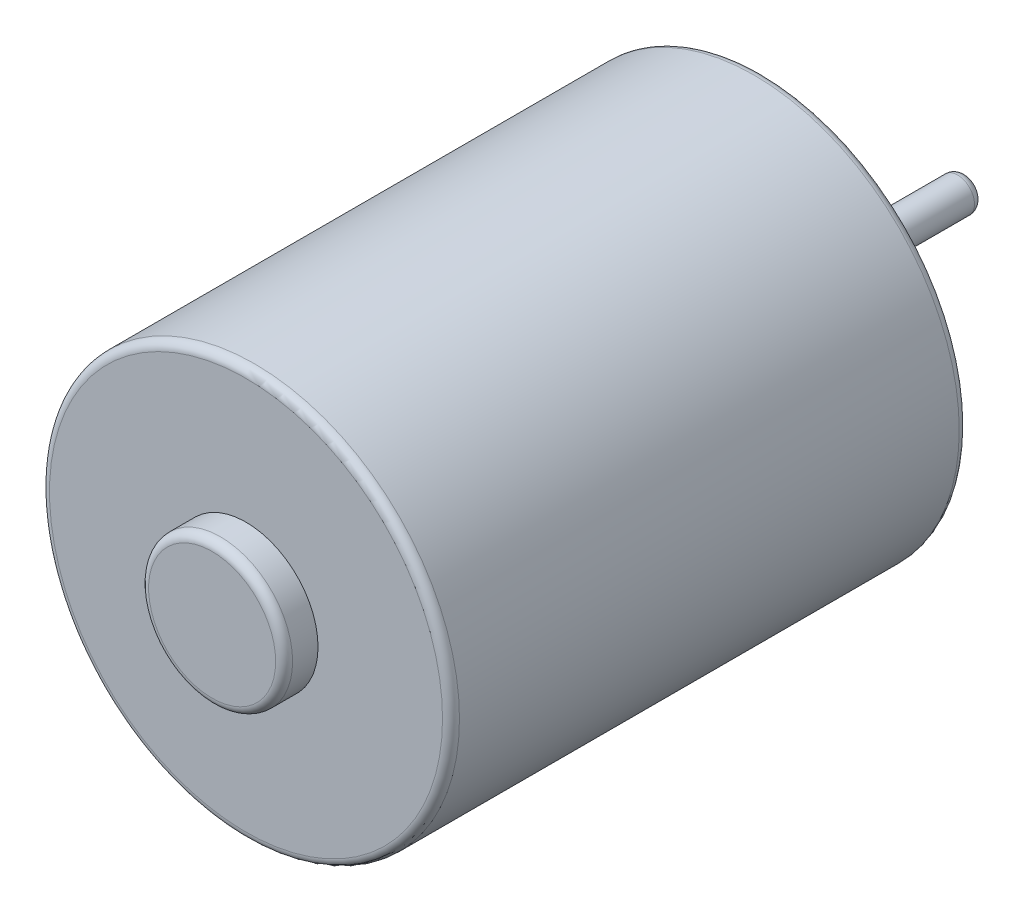
ISO-10303-21;
HEADER;
FILE_DESCRIPTION(('STEP AP214'),'2;1');
FILE_NAME('part.step','',(''),(''),'','','');
FILE_SCHEMA(('AUTOMOTIVE_DESIGN { 1 0 10303 214 1 1 1 1 }'));
ENDSEC;
DATA;
#1=APPLICATION_CONTEXT('core data for automotive mechanical design processes');
#2=APPLICATION_PROTOCOL_DEFINITION('international standard','automotive_design',2000,#1);
#3=PRODUCT_CONTEXT('',#1,'mechanical');
#4=PRODUCT('Part','Part','',(#3));
#5=PRODUCT_RELATED_PRODUCT_CATEGORY('part','',(#4));
#6=PRODUCT_DEFINITION_FORMATION('','',#4);
#7=PRODUCT_DEFINITION_CONTEXT('part definition',#1,'design');
#8=PRODUCT_DEFINITION('design','',#6,#7);
#9=PRODUCT_DEFINITION_SHAPE('','',#8);
#10=(LENGTH_UNIT() NAMED_UNIT(*) SI_UNIT(.MILLI.,.METRE.));
#11=(NAMED_UNIT(*) PLANE_ANGLE_UNIT() SI_UNIT($,.RADIAN.));
#12=(NAMED_UNIT(*) SI_UNIT($,.STERADIAN.) SOLID_ANGLE_UNIT());
#13=UNCERTAINTY_MEASURE_WITH_UNIT(LENGTH_MEASURE(1.E-05),#10,'distance_accuracy_value','');
#14=(GEOMETRIC_REPRESENTATION_CONTEXT(3) GLOBAL_UNCERTAINTY_ASSIGNED_CONTEXT((#13)) GLOBAL_UNIT_ASSIGNED_CONTEXT((#10,
#11,#12)) REPRESENTATION_CONTEXT('',''));
#15=CARTESIAN_POINT('',(0.,0.,0.));
#16=DIRECTION('',(0.,0.,1.));
#17=DIRECTION('',(1.,0.,0.));
#18=AXIS2_PLACEMENT_3D('',#15,#16,#17);
#19=CARTESIAN_POINT('',(0.,0.,30.5));
#20=DIRECTION('',(0.,0.,-1.));
#21=DIRECTION('',(-1.,0.,0.));
#22=AXIS2_PLACEMENT_3D('',#19,#20,#21);
#23=CYLINDRICAL_SURFACE('',#22,12.1);
#24=CARTESIAN_POINT('',(0.,0.,0.5));
#25=DIRECTION('',(0.,0.,1.));
#26=DIRECTION('',(1.,0.,0.));
#27=AXIS2_PLACEMENT_3D('',#24,#25,#26);
#28=CIRCLE('',#27,12.1);
#29=CARTESIAN_POINT('',(-12.1,0.,0.499999999999997));
#30=VERTEX_POINT('',#29);
#31=EDGE_CURVE('E55',#30,#30,#28,.T.);
#32=CARTESIAN_POINT('',(0.,0.,30.));
#33=DIRECTION('',(0.,0.,1.));
#34=DIRECTION('',(1.,0.,0.));
#35=AXIS2_PLACEMENT_3D('',#32,#33,#34);
#36=CIRCLE('',#35,12.1);
#37=CARTESIAN_POINT('',(-12.1,0.,30.));
#38=VERTEX_POINT('',#37);
#39=EDGE_CURVE('E58',#38,#38,#36,.F.);
#40=CARTESIAN_POINT('',(-12.1,0.,0.499999999999997));
#41=CARTESIAN_POINT('',(-12.1,0.,0.807291666666663));
#42=CARTESIAN_POINT('',(-12.1,0.,1.11458333333333));
#43=CARTESIAN_POINT('',(-12.1,0.,1.72916666666666));
#44=CARTESIAN_POINT('',(-12.1,0.,2.03645833333333));
#45=CARTESIAN_POINT('',(-12.1,0.,2.65104166666666));
#46=CARTESIAN_POINT('',(-12.1,0.,2.95833333333333));
#47=CARTESIAN_POINT('',(-12.1,0.,3.57291666666666));
#48=CARTESIAN_POINT('',(-12.1,0.,3.88020833333333));
#49=CARTESIAN_POINT('',(-12.1,0.,4.49479166666666));
#50=CARTESIAN_POINT('',(-12.1,0.,4.80208333333333));
#51=CARTESIAN_POINT('',(-12.1,0.,5.41666666666666));
#52=CARTESIAN_POINT('',(-12.1,0.,5.72395833333333));
#53=CARTESIAN_POINT('',(-12.1,0.,6.33854166666667));
#54=CARTESIAN_POINT('',(-12.1,0.,6.64583333333333));
#55=CARTESIAN_POINT('',(-12.1,0.,7.26041666666666));
#56=CARTESIAN_POINT('',(-12.1,0.,7.56770833333333));
#57=CARTESIAN_POINT('',(-12.1,0.,8.18229166666666));
#58=CARTESIAN_POINT('',(-12.1,0.,8.48958333333333));
#59=CARTESIAN_POINT('',(-12.1,0.,9.10416666666666));
#60=CARTESIAN_POINT('',(-12.1,0.,9.41145833333333));
#61=CARTESIAN_POINT('',(-12.1,0.,10.0260416666667));
#62=CARTESIAN_POINT('',(-12.1,0.,10.3333333333333));
#63=CARTESIAN_POINT('',(-12.1,0.,10.9479166666667));
#64=CARTESIAN_POINT('',(-12.1,0.,11.2552083333333));
#65=CARTESIAN_POINT('',(-12.1,0.,11.8697916666667));
#66=CARTESIAN_POINT('',(-12.1,0.,12.1770833333333));
#67=CARTESIAN_POINT('',(-12.1,0.,12.7916666666667));
#68=CARTESIAN_POINT('',(-12.1,0.,13.0989583333333));
#69=CARTESIAN_POINT('',(-12.1,0.,13.7135416666667));
#70=CARTESIAN_POINT('',(-12.1,0.,14.0208333333333));
#71=CARTESIAN_POINT('',(-12.1,0.,14.6354166666667));
#72=CARTESIAN_POINT('',(-12.1,0.,14.9427083333333));
#73=CARTESIAN_POINT('',(-12.1,0.,15.5572916666667));
#74=CARTESIAN_POINT('',(-12.1,0.,15.8645833333333));
#75=CARTESIAN_POINT('',(-12.1,0.,16.4791666666667));
#76=CARTESIAN_POINT('',(-12.1,0.,16.7864583333333));
#77=CARTESIAN_POINT('',(-12.1,0.,17.4010416666667));
#78=CARTESIAN_POINT('',(-12.1,0.,17.7083333333333));
#79=CARTESIAN_POINT('',(-12.1,0.,18.3229166666667));
#80=CARTESIAN_POINT('',(-12.1,0.,18.6302083333333));
#81=CARTESIAN_POINT('',(-12.1,0.,19.2447916666667));
#82=CARTESIAN_POINT('',(-12.1,0.,19.5520833333333));
#83=CARTESIAN_POINT('',(-12.1,0.,20.1666666666667));
#84=CARTESIAN_POINT('',(-12.1,0.,20.4739583333333));
#85=CARTESIAN_POINT('',(-12.1,0.,21.0885416666667));
#86=CARTESIAN_POINT('',(-12.1,0.,21.3958333333333));
#87=CARTESIAN_POINT('',(-12.1,0.,22.0104166666667));
#88=CARTESIAN_POINT('',(-12.1,0.,22.3177083333333));
#89=CARTESIAN_POINT('',(-12.1,0.,22.9322916666667));
#90=CARTESIAN_POINT('',(-12.1,0.,23.2395833333333));
#91=CARTESIAN_POINT('',(-12.1,0.,23.8541666666667));
#92=CARTESIAN_POINT('',(-12.1,0.,24.1614583333333));
#93=CARTESIAN_POINT('',(-12.1,0.,24.7760416666667));
#94=CARTESIAN_POINT('',(-12.1,0.,25.0833333333333));
#95=CARTESIAN_POINT('',(-12.1,0.,25.6979166666667));
#96=CARTESIAN_POINT('',(-12.1,0.,26.0052083333333));
#97=CARTESIAN_POINT('',(-12.1,0.,26.6197916666667));
#98=CARTESIAN_POINT('',(-12.1,0.,26.9270833333333));
#99=CARTESIAN_POINT('',(-12.1,0.,27.5416666666667));
#100=CARTESIAN_POINT('',(-12.1,0.,27.8489583333333));
#101=CARTESIAN_POINT('',(-12.1,0.,28.4635416666667));
#102=CARTESIAN_POINT('',(-12.1,0.,28.7708333333333));
#103=CARTESIAN_POINT('',(-12.1,0.,29.3854166666667));
#104=CARTESIAN_POINT('',(-12.1,0.,29.6927083333333));
#105=CARTESIAN_POINT('',(-12.1,0.,30.));
#106=B_SPLINE_CURVE_WITH_KNOTS('',3,(#40,#41,#42,#43,#44,#45,#46,#47,#48,#49,#50,#51,#52,#53,
#54,#55,#56,#57,#58,#59,#60,#61,#62,#63,#64,#65,#66,#67,#68,#69,#70,#71,#72,#73,#74,#75,#76,#77,
#78,#79,#80,#81,#82,#83,#84,#85,#86,#87,#88,#89,#90,#91,#92,#93,#94,#95,#96,#97,#98,#99,#100,
#101,#102,#103,#104,#105),.UNSPECIFIED.,.F.,.F.,(4,2,2,2,2,2,2,2,2,2,2,2,2,2,2,2,2,2,2,2,2,2,2,
2,2,2,2,2,2,2,2,2,4),(0.,0.921874999999999,1.84375,2.765625,3.6875,4.609375,5.53125,6.453125,
7.375,8.296875,9.21875,10.140625,11.0625,11.984375,12.90625,13.828125,14.75,15.671875,16.59375,
17.515625,18.4375,19.359375,20.28125,21.203125,22.125,23.046875,23.96875,24.890625,25.8125,
26.734375,27.65625,28.578125,29.5),.UNSPECIFIED.);
#107=EDGE_CURVE('BSEAM35',#30,#38,#106,.T.);
#108=ORIENTED_EDGE('',*,*,#31,.T.);
#109=ORIENTED_EDGE('',*,*,#39,.T.);
#110=ORIENTED_EDGE('',*,*,#107,.T.);
#111=ORIENTED_EDGE('',*,*,#107,.F.);
#112=EDGE_LOOP('',(#108,#110,#109,#111));
#113=FACE_BOUND('',#112,.T.);
#114=ADVANCED_FACE('F35',(#113),#23,.T.);
#115=CARTESIAN_POINT('',(0.,0.,30.5));
#116=DIRECTION('',(0.,0.,1.));
#117=DIRECTION('',(1.,0.,0.));
#118=AXIS2_PLACEMENT_3D('',#115,#116,#117);
#119=PLANE('',#118);
#120=CARTESIAN_POINT('',(0.,0.,30.5));
#121=DIRECTION('',(0.,0.,1.));
#122=DIRECTION('',(1.,0.,0.));
#123=AXIS2_PLACEMENT_3D('',#120,#121,#122);
#124=CIRCLE('',#123,11.6);
#125=CARTESIAN_POINT('',(11.6,0.,30.5));
#126=VERTEX_POINT('',#125);
#127=EDGE_CURVE('E10',#126,#126,#124,.T.);
#128=ORIENTED_EDGE('',*,*,#127,.T.);
#129=EDGE_LOOP('',(#128));
#130=FACE_BOUND('',#129,.T.);
#131=CARTESIAN_POINT('',(0.,0.,30.5));
#132=DIRECTION('',(0.,0.,1.));
#133=DIRECTION('',(1.,0.,0.));
#134=AXIS2_PLACEMENT_3D('',#131,#132,#133);
#135=CIRCLE('',#134,4.25);
#136=CARTESIAN_POINT('',(4.25,0.,30.5));
#137=VERTEX_POINT('',#136);
#138=EDGE_CURVE('E73',#137,#137,#135,.T.);
#139=ORIENTED_EDGE('',*,*,#138,.F.);
#140=EDGE_LOOP('',(#139));
#141=FACE_BOUND('',#140,.T.);
#142=ADVANCED_FACE('F85',(#130,#141),#119,.T.);
#143=CARTESIAN_POINT('',(0.,0.,0.));
#144=DIRECTION('',(0.,0.,1.));
#145=DIRECTION('',(1.,0.,0.));
#146=AXIS2_PLACEMENT_3D('',#143,#144,#145);
#147=PLANE('',#146);
#148=CARTESIAN_POINT('',(0.,0.,0.));
#149=DIRECTION('',(0.,0.,1.));
#150=DIRECTION('',(1.,0.,0.));
#151=AXIS2_PLACEMENT_3D('',#148,#149,#150);
#152=CIRCLE('',#151,11.6);
#153=CARTESIAN_POINT('',(11.6,0.,0.));
#154=VERTEX_POINT('',#153);
#155=EDGE_CURVE('E50',#154,#154,#152,.F.);
#156=ORIENTED_EDGE('',*,*,#155,.T.);
#157=EDGE_LOOP('',(#156));
#158=FACE_BOUND('',#157,.T.);
#159=CARTESIAN_POINT('',(0.,0.,0.));
#160=DIRECTION('',(0.,0.,1.));
#161=DIRECTION('',(1.,0.,0.));
#162=AXIS2_PLACEMENT_3D('',#159,#160,#161);
#163=CIRCLE('',#162,3.175);
#164=CARTESIAN_POINT('',(3.175,0.,0.));
#165=VERTEX_POINT('',#164);
#166=EDGE_CURVE('E74',#165,#165,#163,.T.);
#167=ORIENTED_EDGE('',*,*,#166,.T.);
#168=EDGE_LOOP('',(#167));
#169=FACE_BOUND('',#168,.T.);
#170=ADVANCED_FACE('F87',(#158,#169),#147,.F.);
#171=CARTESIAN_POINT('',(0.,0.,-1.6));
#172=DIRECTION('',(0.,0.,1.));
#173=DIRECTION('',(1.,0.,0.));
#174=AXIS2_PLACEMENT_3D('',#171,#172,#173);
#175=CYLINDRICAL_SURFACE('',#174,3.175);
#176=CARTESIAN_POINT('',(0.,0.,-1.1));
#177=DIRECTION('',(0.,0.,1.));
#178=DIRECTION('',(1.,0.,0.));
#179=AXIS2_PLACEMENT_3D('',#176,#177,#178);
#180=CIRCLE('',#179,3.175);
#181=CARTESIAN_POINT('',(3.175,0.,-1.1));
#182=VERTEX_POINT('',#181);
#183=EDGE_CURVE('E64',#182,#182,#180,.T.);
#184=ORIENTED_EDGE('',*,*,#183,.T.);
#185=EDGE_LOOP('',(#184));
#186=FACE_BOUND('',#185,.T.);
#187=ORIENTED_EDGE('',*,*,#166,.F.);
#188=EDGE_LOOP('',(#187));
#189=FACE_BOUND('',#188,.T.);
#190=ADVANCED_FACE('F93',(#186,#189),#175,.T.);
#191=CARTESIAN_POINT('',(0.,0.,-1.6));
#192=DIRECTION('',(0.,0.,1.));
#193=DIRECTION('',(1.,0.,0.));
#194=AXIS2_PLACEMENT_3D('',#191,#192,#193);
#195=PLANE('',#194);
#196=CARTESIAN_POINT('',(0.,0.,-1.6));
#197=DIRECTION('',(0.,0.,1.));
#198=DIRECTION('',(1.,0.,0.));
#199=AXIS2_PLACEMENT_3D('',#196,#197,#198);
#200=CIRCLE('',#199,2.675);
#201=CARTESIAN_POINT('',(2.675,0.,-1.6));
#202=VERTEX_POINT('',#201);
#203=EDGE_CURVE('E61',#202,#202,#200,.F.);
#204=ORIENTED_EDGE('',*,*,#203,.T.);
#205=EDGE_LOOP('',(#204));
#206=FACE_BOUND('',#205,.T.);
#207=CARTESIAN_POINT('',(0.,0.,-1.6));
#208=DIRECTION('',(0.,0.,1.));
#209=DIRECTION('',(1.,0.,0.));
#210=AXIS2_PLACEMENT_3D('',#207,#208,#209);
#211=CIRCLE('',#210,1.);
#212=CARTESIAN_POINT('',(1.,0.,-1.6));
#213=VERTEX_POINT('',#212);
#214=EDGE_CURVE('E77',#213,#213,#211,.T.);
#215=ORIENTED_EDGE('',*,*,#214,.T.);
#216=EDGE_LOOP('',(#215));
#217=FACE_BOUND('',#216,.T.);
#218=ADVANCED_FACE('F131',(#206,#217),#195,.F.);
#219=CARTESIAN_POINT('',(0.,0.,-12.));
#220=DIRECTION('',(0.,0.,1.));
#221=DIRECTION('',(1.,0.,0.));
#222=AXIS2_PLACEMENT_3D('',#219,#220,#221);
#223=PLANE('',#222);
#224=CARTESIAN_POINT('',(0.,0.,-12.));
#225=DIRECTION('',(0.,0.,1.));
#226=DIRECTION('',(1.,0.,0.));
#227=AXIS2_PLACEMENT_3D('',#224,#225,#226);
#228=CIRCLE('',#227,0.5);
#229=CARTESIAN_POINT('',(0.5,0.,-12.));
#230=VERTEX_POINT('',#229);
#231=EDGE_CURVE('E67',#230,#230,#228,.F.);
#232=ORIENTED_EDGE('',*,*,#231,.T.);
#233=EDGE_LOOP('',(#232));
#234=FACE_BOUND('',#233,.T.);
#235=ADVANCED_FACE('F134',(#234),#223,.F.);
#236=CARTESIAN_POINT('',(0.,0.,-12.));
#237=DIRECTION('',(0.,0.,1.));
#238=DIRECTION('',(1.,0.,0.));
#239=AXIS2_PLACEMENT_3D('',#236,#237,#238);
#240=CYLINDRICAL_SURFACE('',#239,1.);
#241=CARTESIAN_POINT('',(0.,0.,-11.5));
#242=DIRECTION('',(0.,0.,1.));
#243=DIRECTION('',(1.,0.,0.));
#244=AXIS2_PLACEMENT_3D('',#241,#242,#243);
#245=CIRCLE('',#244,1.);
#246=CARTESIAN_POINT('',(1.,0.,-11.5));
#247=VERTEX_POINT('',#246);
#248=EDGE_CURVE('E70',#247,#247,#245,.T.);
#249=ORIENTED_EDGE('',*,*,#248,.T.);
#250=EDGE_LOOP('',(#249));
#251=FACE_BOUND('',#250,.T.);
#252=ORIENTED_EDGE('',*,*,#214,.F.);
#253=EDGE_LOOP('',(#252));
#254=FACE_BOUND('',#253,.T.);
#255=ADVANCED_FACE('F99',(#251,#254),#240,.T.);
#256=CARTESIAN_POINT('',(0.,0.,32.5));
#257=DIRECTION('',(0.,0.,-1.));
#258=DIRECTION('',(-1.,0.,0.));
#259=AXIS2_PLACEMENT_3D('',#256,#257,#258);
#260=CYLINDRICAL_SURFACE('',#259,4.25);
#261=CARTESIAN_POINT('',(0.,0.,32.));
#262=DIRECTION('',(0.,0.,1.));
#263=DIRECTION('',(1.,0.,0.));
#264=AXIS2_PLACEMENT_3D('',#261,#262,#263);
#265=CIRCLE('',#264,4.25);
#266=CARTESIAN_POINT('',(4.25,0.,32.));
#267=VERTEX_POINT('',#266);
#268=EDGE_CURVE('E42',#267,#267,#265,.F.);
#269=ORIENTED_EDGE('',*,*,#268,.T.);
#270=EDGE_LOOP('',(#269));
#271=FACE_BOUND('',#270,.T.);
#272=ORIENTED_EDGE('',*,*,#138,.T.);
#273=EDGE_LOOP('',(#272));
#274=FACE_BOUND('',#273,.T.);
#275=ADVANCED_FACE('F83',(#271,#274),#260,.T.);
#276=CARTESIAN_POINT('',(0.,0.,32.5));
#277=DIRECTION('',(0.,0.,1.));
#278=DIRECTION('',(1.,0.,0.));
#279=AXIS2_PLACEMENT_3D('',#276,#277,#278);
#280=PLANE('',#279);
#281=CARTESIAN_POINT('',(0.,0.,32.5));
#282=DIRECTION('',(0.,0.,1.));
#283=DIRECTION('',(1.,0.,0.));
#284=AXIS2_PLACEMENT_3D('',#281,#282,#283);
#285=CIRCLE('',#284,3.75);
#286=CARTESIAN_POINT('',(3.75,0.,32.5));
#287=VERTEX_POINT('',#286);
#288=EDGE_CURVE('E46',#287,#287,#285,.T.);
#289=ORIENTED_EDGE('',*,*,#288,.T.);
#290=EDGE_LOOP('',(#289));
#291=FACE_BOUND('',#290,.T.);
#292=ADVANCED_FACE('F106',(#291),#280,.T.);
#293=CARTESIAN_POINT('',(0.,0.,-11.5));
#294=DIRECTION('',(0.,0.,1.));
#295=DIRECTION('',(1.,0.,0.));
#296=AXIS2_PLACEMENT_3D('',#293,#294,#295);
#297=DEGENERATE_TOROIDAL_SURFACE('',#296,0.5,0.5,.T.);
#298=ORIENTED_EDGE('',*,*,#231,.F.);
#299=EDGE_LOOP('',(#298));
#300=FACE_BOUND('',#299,.T.);
#301=ORIENTED_EDGE('',*,*,#248,.F.);
#302=EDGE_LOOP('',(#301));
#303=FACE_BOUND('',#302,.T.);
#304=ADVANCED_FACE('F102',(#300,#303),#297,.T.);
#305=CARTESIAN_POINT('',(0.,0.,-1.1));
#306=DIRECTION('',(0.,0.,1.));
#307=DIRECTION('',(1.,0.,0.));
#308=AXIS2_PLACEMENT_3D('',#305,#306,#307);
#309=TOROIDAL_SURFACE('',#308,2.675,0.5);
#310=ORIENTED_EDGE('',*,*,#203,.F.);
#311=EDGE_LOOP('',(#310));
#312=FACE_BOUND('',#311,.T.);
#313=ORIENTED_EDGE('',*,*,#183,.F.);
#314=EDGE_LOOP('',(#313));
#315=FACE_BOUND('',#314,.T.);
#316=ADVANCED_FACE('F105',(#312,#315),#309,.T.);
#317=CARTESIAN_POINT('',(0.,0.,0.5));
#318=DIRECTION('',(0.,0.,1.));
#319=DIRECTION('',(1.,0.,0.));
#320=AXIS2_PLACEMENT_3D('',#317,#318,#319);
#321=TOROIDAL_SURFACE('',#320,11.6,0.5);
#322=ORIENTED_EDGE('',*,*,#155,.F.);
#323=EDGE_LOOP('',(#322));
#324=FACE_BOUND('',#323,.T.);
#325=ORIENTED_EDGE('',*,*,#31,.F.);
#326=EDGE_LOOP('',(#325));
#327=FACE_BOUND('',#326,.T.);
#328=ADVANCED_FACE('F110',(#324,#327),#321,.T.);
#329=CARTESIAN_POINT('',(0.,0.,32.));
#330=DIRECTION('',(0.,0.,1.));
#331=DIRECTION('',(1.,0.,0.));
#332=AXIS2_PLACEMENT_3D('',#329,#330,#331);
#333=TOROIDAL_SURFACE('',#332,3.75,0.5);
#334=ORIENTED_EDGE('',*,*,#268,.F.);
#335=EDGE_LOOP('',(#334));
#336=FACE_BOUND('',#335,.T.);
#337=ORIENTED_EDGE('',*,*,#288,.F.);
#338=EDGE_LOOP('',(#337));
#339=FACE_BOUND('',#338,.T.);
#340=ADVANCED_FACE('F113',(#336,#339),#333,.T.);
#341=CARTESIAN_POINT('',(0.,0.,30.));
#342=DIRECTION('',(0.,0.,1.));
#343=DIRECTION('',(1.,0.,0.));
#344=AXIS2_PLACEMENT_3D('',#341,#342,#343);
#345=TOROIDAL_SURFACE('',#344,11.6,0.5);
#346=ORIENTED_EDGE('',*,*,#39,.F.);
#347=EDGE_LOOP('',(#346));
#348=FACE_BOUND('',#347,.T.);
#349=ORIENTED_EDGE('',*,*,#127,.F.);
#350=EDGE_LOOP('',(#349));
#351=FACE_BOUND('',#350,.T.);
#352=ADVANCED_FACE('F37',(#348,#351),#345,.T.);
#353=CLOSED_SHELL('',(#114,#142,#170,#190,#218,#235,#255,#275,#292,#304,#316,#328,#340,#352));
#354=MANIFOLD_SOLID_BREP('B2',#353);
#355=ADVANCED_BREP_SHAPE_REPRESENTATION('',(#18,#354),#14);
#356=SHAPE_DEFINITION_REPRESENTATION(#9,#355);
ENDSEC;
END-ISO-10303-21;
